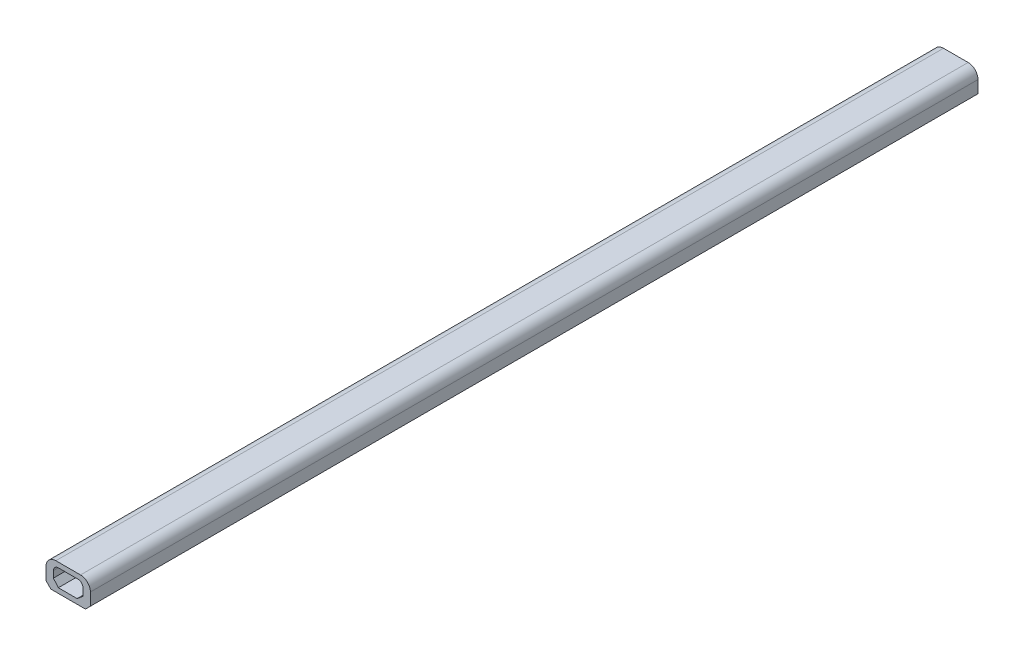
ISO-10303-21;
HEADER;
FILE_DESCRIPTION(('STEP AP214'),'2;1');
FILE_NAME('part.step','',(''),(''),'','','');
FILE_SCHEMA(('AUTOMOTIVE_DESIGN { 1 0 10303 214 1 1 1 1 }'));
ENDSEC;
DATA;
#1=APPLICATION_CONTEXT('core data for automotive mechanical design processes');
#2=APPLICATION_PROTOCOL_DEFINITION('international standard','automotive_design',2000,#1);
#3=PRODUCT_CONTEXT('',#1,'mechanical');
#4=PRODUCT('Part','Part','',(#3));
#5=PRODUCT_RELATED_PRODUCT_CATEGORY('part','',(#4));
#6=PRODUCT_DEFINITION_FORMATION('','',#4);
#7=PRODUCT_DEFINITION_CONTEXT('part definition',#1,'design');
#8=PRODUCT_DEFINITION('design','',#6,#7);
#9=PRODUCT_DEFINITION_SHAPE('','',#8);
#10=(LENGTH_UNIT() NAMED_UNIT(*) SI_UNIT(.MILLI.,.METRE.));
#11=(NAMED_UNIT(*) PLANE_ANGLE_UNIT() SI_UNIT($,.RADIAN.));
#12=(NAMED_UNIT(*) SI_UNIT($,.STERADIAN.) SOLID_ANGLE_UNIT());
#13=UNCERTAINTY_MEASURE_WITH_UNIT(LENGTH_MEASURE(1.E-05),#10,'distance_accuracy_value','');
#14=(GEOMETRIC_REPRESENTATION_CONTEXT(3) GLOBAL_UNCERTAINTY_ASSIGNED_CONTEXT((#13)) GLOBAL_UNIT_ASSIGNED_CONTEXT((#10,
#11,#12)) REPRESENTATION_CONTEXT('',''));
#15=CARTESIAN_POINT('',(0.,0.,0.));
#16=DIRECTION('',(0.,0.,1.));
#17=DIRECTION('',(1.,0.,0.));
#18=AXIS2_PLACEMENT_3D('',#15,#16,#17);
#19=CARTESIAN_POINT('',(0.,0.,180.));
#20=DIRECTION('',(1.,0.,0.));
#21=DIRECTION('',(0.,1.,0.));
#22=AXIS2_PLACEMENT_3D('',#19,#20,#21);
#23=PLANE('',#22);
#24=DIRECTION('',(0.,-1.,0.));
#25=VECTOR('',#24,1.);
#26=CARTESIAN_POINT('',(0.,0.,0.));
#27=LINE('',#26,#25);
#28=CARTESIAN_POINT('',(0.,-2.,0.));
#29=VERTEX_POINT('',#28);
#30=CARTESIAN_POINT('',(0.,-4.5,0.));
#31=VERTEX_POINT('',#30);
#32=EDGE_CURVE('E169',#29,#31,#27,.T.);
#33=ORIENTED_EDGE('',*,*,#32,.T.);
#34=DIRECTION('',(0.,0.,1.));
#35=VECTOR('',#34,1.);
#36=CARTESIAN_POINT('',(0.,-4.5,180.));
#37=LINE('',#36,#35);
#38=CARTESIAN_POINT('',(0.,-4.5,180.));
#39=VERTEX_POINT('',#38);
#40=EDGE_CURVE('E212',#31,#39,#37,.T.);
#41=ORIENTED_EDGE('',*,*,#40,.T.);
#42=DIRECTION('',(0.,-1.,0.));
#43=VECTOR('',#42,1.);
#44=CARTESIAN_POINT('',(0.,0.,180.));
#45=LINE('',#44,#43);
#46=CARTESIAN_POINT('',(0.,-2.,180.));
#47=VERTEX_POINT('',#46);
#48=EDGE_CURVE('E172',#47,#39,#45,.T.);
#49=ORIENTED_EDGE('',*,*,#48,.F.);
#50=DIRECTION('',(0.,0.,-1.));
#51=VECTOR('',#50,1.);
#52=CARTESIAN_POINT('',(0.,-2.,180.));
#53=LINE('',#52,#51);
#54=EDGE_CURVE('E157',#47,#29,#53,.T.);
#55=ORIENTED_EDGE('',*,*,#54,.T.);
#56=EDGE_LOOP('',(#33,#41,#49,#55));
#57=FACE_BOUND('',#56,.T.);
#58=ADVANCED_FACE('F39',(#57),#23,.F.);
#59=CARTESIAN_POINT('',(0.,-5.5,180.));
#60=DIRECTION('',(0.,1.,0.));
#61=DIRECTION('',(0.,0.,1.));
#62=AXIS2_PLACEMENT_3D('',#59,#60,#61);
#63=PLANE('',#62);
#64=DIRECTION('',(1.,0.,0.));
#65=VECTOR('',#64,1.);
#66=CARTESIAN_POINT('',(0.,-5.5,180.));
#67=LINE('',#66,#65);
#68=CARTESIAN_POINT('',(0.999999999999973,-5.5,180.));
#69=VERTEX_POINT('',#68);
#70=CARTESIAN_POINT('',(8.,-5.5,180.));
#71=VERTEX_POINT('',#70);
#72=EDGE_CURVE('E288',#69,#71,#67,.T.);
#73=ORIENTED_EDGE('',*,*,#72,.F.);
#74=DIRECTION('',(0.,0.,-1.));
#75=VECTOR('',#74,1.);
#76=CARTESIAN_POINT('',(0.999999999999973,-5.5,180.));
#77=LINE('',#76,#75);
#78=CARTESIAN_POINT('',(0.999999999999973,-5.5,0.));
#79=VERTEX_POINT('',#78);
#80=EDGE_CURVE('E206',#69,#79,#77,.T.);
#81=ORIENTED_EDGE('',*,*,#80,.T.);
#82=DIRECTION('',(1.,0.,0.));
#83=VECTOR('',#82,1.);
#84=CARTESIAN_POINT('',(0.,-5.5,0.));
#85=LINE('',#84,#83);
#86=CARTESIAN_POINT('',(8.,-5.5,0.));
#87=VERTEX_POINT('',#86);
#88=EDGE_CURVE('E178',#79,#87,#85,.T.);
#89=ORIENTED_EDGE('',*,*,#88,.T.);
#90=DIRECTION('',(0.,0.,1.));
#91=VECTOR('',#90,1.);
#92=CARTESIAN_POINT('',(8.,-5.5,180.));
#93=LINE('',#92,#91);
#94=EDGE_CURVE('E204',#87,#71,#93,.T.);
#95=ORIENTED_EDGE('',*,*,#94,.T.);
#96=EDGE_LOOP('',(#73,#81,#89,#95));
#97=FACE_BOUND('',#96,.T.);
#98=ADVANCED_FACE('F311',(#97),#63,.F.);
#99=CARTESIAN_POINT('',(9.,0.,180.));
#100=DIRECTION('',(-1.,0.,0.));
#101=DIRECTION('',(0.,0.,1.));
#102=AXIS2_PLACEMENT_3D('',#99,#100,#101);
#103=PLANE('',#102);
#104=DIRECTION('',(0.,1.,0.));
#105=VECTOR('',#104,1.);
#106=CARTESIAN_POINT('',(9.,0.,180.));
#107=LINE('',#106,#105);
#108=CARTESIAN_POINT('',(9.,-4.5,180.));
#109=VERTEX_POINT('',#108);
#110=CARTESIAN_POINT('',(9.,-2.,180.));
#111=VERTEX_POINT('',#110);
#112=EDGE_CURVE('E290',#109,#111,#107,.T.);
#113=ORIENTED_EDGE('',*,*,#112,.F.);
#114=DIRECTION('',(0.,0.,-1.));
#115=VECTOR('',#114,1.);
#116=CARTESIAN_POINT('',(9.,-4.5,180.));
#117=LINE('',#116,#115);
#118=CARTESIAN_POINT('',(9.,-4.5,0.));
#119=VERTEX_POINT('',#118);
#120=EDGE_CURVE('E218',#109,#119,#117,.T.);
#121=ORIENTED_EDGE('',*,*,#120,.T.);
#122=DIRECTION('',(0.,1.,0.));
#123=VECTOR('',#122,1.);
#124=CARTESIAN_POINT('',(9.,0.,0.));
#125=LINE('',#124,#123);
#126=CARTESIAN_POINT('',(9.,-2.,0.));
#127=VERTEX_POINT('',#126);
#128=EDGE_CURVE('E182',#119,#127,#125,.T.);
#129=ORIENTED_EDGE('',*,*,#128,.T.);
#130=DIRECTION('',(0.,0.,-1.));
#131=VECTOR('',#130,1.);
#132=CARTESIAN_POINT('',(9.,-2.,180.));
#133=LINE('',#132,#131);
#134=EDGE_CURVE('E201',#127,#111,#133,.F.);
#135=ORIENTED_EDGE('',*,*,#134,.T.);
#136=EDGE_LOOP('',(#113,#121,#129,#135));
#137=FACE_BOUND('',#136,.T.);
#138=ADVANCED_FACE('F303',(#137),#103,.F.);
#139=CARTESIAN_POINT('',(0.,0.,180.));
#140=DIRECTION('',(0.,-1.,0.));
#141=DIRECTION('',(0.,0.,-1.));
#142=AXIS2_PLACEMENT_3D('',#139,#140,#141);
#143=PLANE('',#142);
#144=DIRECTION('',(-1.,0.,0.));
#145=VECTOR('',#144,1.);
#146=CARTESIAN_POINT('',(0.,0.,0.));
#147=LINE('',#146,#145);
#148=CARTESIAN_POINT('',(7.,0.,0.));
#149=VERTEX_POINT('',#148);
#150=CARTESIAN_POINT('',(2.,0.,0.));
#151=VERTEX_POINT('',#150);
#152=EDGE_CURVE('E190',#149,#151,#147,.T.);
#153=ORIENTED_EDGE('',*,*,#152,.T.);
#154=DIRECTION('',(0.,0.,-1.));
#155=VECTOR('',#154,1.);
#156=CARTESIAN_POINT('',(2.,0.,180.));
#157=LINE('',#156,#155);
#158=CARTESIAN_POINT('',(2.,0.,180.));
#159=VERTEX_POINT('',#158);
#160=EDGE_CURVE('E158',#151,#159,#157,.F.);
#161=ORIENTED_EDGE('',*,*,#160,.T.);
#162=DIRECTION('',(-1.,0.,0.));
#163=VECTOR('',#162,1.);
#164=CARTESIAN_POINT('',(0.,0.,180.));
#165=LINE('',#164,#163);
#166=CARTESIAN_POINT('',(7.,0.,180.));
#167=VERTEX_POINT('',#166);
#168=EDGE_CURVE('E173',#167,#159,#165,.T.);
#169=ORIENTED_EDGE('',*,*,#168,.F.);
#170=DIRECTION('',(0.,0.,-1.));
#171=VECTOR('',#170,1.);
#172=CARTESIAN_POINT('',(7.,0.,180.));
#173=LINE('',#172,#171);
#174=EDGE_CURVE('E163',#167,#149,#173,.T.);
#175=ORIENTED_EDGE('',*,*,#174,.T.);
#176=EDGE_LOOP('',(#153,#161,#169,#175));
#177=FACE_BOUND('',#176,.T.);
#178=ADVANCED_FACE('F297',(#177),#143,.F.);
#179=CARTESIAN_POINT('',(0.,0.,180.));
#180=DIRECTION('',(0.,0.,1.));
#181=DIRECTION('',(1.,0.,0.));
#182=AXIS2_PLACEMENT_3D('',#179,#180,#181);
#183=PLANE('',#182);
#184=DIRECTION('',(0.,-1.,0.));
#185=VECTOR('',#184,1.);
#186=CARTESIAN_POINT('',(7.5,-1.,180.));
#187=LINE('',#186,#185);
#188=CARTESIAN_POINT('',(7.5,-2.,180.));
#189=VERTEX_POINT('',#188);
#190=CARTESIAN_POINT('',(7.5,-3.49999999999999,180.));
#191=VERTEX_POINT('',#190);
#192=EDGE_CURVE('E179',#189,#191,#187,.T.);
#193=ORIENTED_EDGE('',*,*,#192,.T.);
#194=DIRECTION('',(0.766044443118982,0.642787609686535,0.));
#195=VECTOR('',#194,1.);
#196=CARTESIAN_POINT('',(6.30824640740576,-4.5,180.));
#197=LINE('',#196,#195);
#198=CARTESIAN_POINT('',(6.30824640740576,-4.5,180.));
#199=VERTEX_POINT('',#198);
#200=EDGE_CURVE('E11',#191,#199,#197,.F.);
#201=ORIENTED_EDGE('',*,*,#200,.T.);
#202=DIRECTION('',(-1.,0.,0.));
#203=VECTOR('',#202,1.);
#204=CARTESIAN_POINT('',(7.5,-4.5,180.));
#205=LINE('',#204,#203);
#206=CARTESIAN_POINT('',(2.50000000000002,-4.5,180.));
#207=VERTEX_POINT('',#206);
#208=EDGE_CURVE('E261',#199,#207,#205,.T.);
#209=ORIENTED_EDGE('',*,*,#208,.T.);
#210=DIRECTION('',(-0.642787609686535,0.766044443118982,0.));
#211=VECTOR('',#210,1.);
#212=CARTESIAN_POINT('',(1.5,-3.30824640740576,180.));
#213=LINE('',#212,#211);
#214=CARTESIAN_POINT('',(1.5,-3.30824640740576,180.));
#215=VERTEX_POINT('',#214);
#216=EDGE_CURVE('E250',#207,#215,#213,.T.);
#217=ORIENTED_EDGE('',*,*,#216,.T.);
#218=DIRECTION('',(0.,-1.,0.));
#219=VECTOR('',#218,1.);
#220=CARTESIAN_POINT('',(1.5,-1.,180.));
#221=LINE('',#220,#219);
#222=CARTESIAN_POINT('',(1.5,-2.,180.));
#223=VERTEX_POINT('',#222);
#224=EDGE_CURVE('E258',#223,#215,#221,.T.);
#225=ORIENTED_EDGE('',*,*,#224,.F.);
#226=CARTESIAN_POINT('',(2.5,-2.,180.));
#227=DIRECTION('',(0.,0.,1.));
#228=DIRECTION('',(1.,0.,0.));
#229=AXIS2_PLACEMENT_3D('',#226,#227,#228);
#230=CIRCLE('',#229,1.);
#231=CARTESIAN_POINT('',(2.5,-1.,180.));
#232=VERTEX_POINT('',#231);
#233=EDGE_CURVE('E233',#223,#232,#230,.F.);
#234=ORIENTED_EDGE('',*,*,#233,.T.);
#235=DIRECTION('',(-1.,0.,0.));
#236=VECTOR('',#235,1.);
#237=CARTESIAN_POINT('',(7.5,-1.,180.));
#238=LINE('',#237,#236);
#239=CARTESIAN_POINT('',(6.5,-1.,180.));
#240=VERTEX_POINT('',#239);
#241=EDGE_CURVE('E184',#240,#232,#238,.T.);
#242=ORIENTED_EDGE('',*,*,#241,.F.);
#243=CARTESIAN_POINT('',(6.5,-2.,180.));
#244=DIRECTION('',(0.,0.,1.));
#245=DIRECTION('',(1.,0.,0.));
#246=AXIS2_PLACEMENT_3D('',#243,#244,#245);
#247=CIRCLE('',#246,1.);
#248=EDGE_CURVE('E237',#240,#189,#247,.F.);
#249=ORIENTED_EDGE('',*,*,#248,.T.);
#250=EDGE_LOOP('',(#193,#201,#209,#217,#225,#234,#242,#249));
#251=FACE_BOUND('',#250,.T.);
#252=ORIENTED_EDGE('',*,*,#48,.T.);
#253=DIRECTION('',(-0.707106781186537,0.707106781186558,0.));
#254=VECTOR('',#253,1.);
#255=CARTESIAN_POINT('',(-2.25,-2.24999999999993,180.));
#256=LINE('',#255,#254);
#257=EDGE_CURVE('E216',#39,#69,#256,.F.);
#258=ORIENTED_EDGE('',*,*,#257,.T.);
#259=ORIENTED_EDGE('',*,*,#72,.T.);
#260=DIRECTION('',(-0.707106781186548,-0.707106781186547,0.));
#261=VECTOR('',#260,1.);
#262=CARTESIAN_POINT('',(6.75,-6.75,180.));
#263=LINE('',#262,#261);
#264=EDGE_CURVE('E214',#71,#109,#263,.F.);
#265=ORIENTED_EDGE('',*,*,#264,.T.);
#266=ORIENTED_EDGE('',*,*,#112,.T.);
#267=CARTESIAN_POINT('',(7.,-2.,180.));
#268=DIRECTION('',(0.,0.,1.));
#269=DIRECTION('',(1.,0.,0.));
#270=AXIS2_PLACEMENT_3D('',#267,#268,#269);
#271=CIRCLE('',#270,2.);
#272=EDGE_CURVE('E197',#111,#167,#271,.T.);
#273=ORIENTED_EDGE('',*,*,#272,.T.);
#274=ORIENTED_EDGE('',*,*,#168,.T.);
#275=CARTESIAN_POINT('',(2.,-2.,180.));
#276=DIRECTION('',(0.,0.,1.));
#277=DIRECTION('',(1.,0.,0.));
#278=AXIS2_PLACEMENT_3D('',#275,#276,#277);
#279=CIRCLE('',#278,2.);
#280=EDGE_CURVE('E199',#159,#47,#279,.T.);
#281=ORIENTED_EDGE('',*,*,#280,.T.);
#282=EDGE_LOOP('',(#252,#258,#259,#265,#266,#273,#274,#281));
#283=FACE_BOUND('',#282,.T.);
#284=ADVANCED_FACE('F256',(#251,#283),#183,.T.);
#285=CARTESIAN_POINT('',(0.,0.,0.));
#286=DIRECTION('',(0.,0.,1.));
#287=DIRECTION('',(1.,0.,0.));
#288=AXIS2_PLACEMENT_3D('',#285,#286,#287);
#289=PLANE('',#288);
#290=DIRECTION('',(-1.,0.,0.));
#291=VECTOR('',#290,1.);
#292=CARTESIAN_POINT('',(7.5,-1.,0.));
#293=LINE('',#292,#291);
#294=CARTESIAN_POINT('',(6.5,-1.,0.));
#295=VERTEX_POINT('',#294);
#296=CARTESIAN_POINT('',(2.5,-1.,0.));
#297=VERTEX_POINT('',#296);
#298=EDGE_CURVE('E280',#295,#297,#293,.T.);
#299=ORIENTED_EDGE('',*,*,#298,.T.);
#300=CARTESIAN_POINT('',(2.5,-2.,0.));
#301=DIRECTION('',(0.,0.,1.));
#302=DIRECTION('',(1.,0.,0.));
#303=AXIS2_PLACEMENT_3D('',#300,#301,#302);
#304=CIRCLE('',#303,1.);
#305=CARTESIAN_POINT('',(1.5,-2.,0.));
#306=VERTEX_POINT('',#305);
#307=EDGE_CURVE('E231',#297,#306,#304,.T.);
#308=ORIENTED_EDGE('',*,*,#307,.T.);
#309=DIRECTION('',(0.,-1.,0.));
#310=VECTOR('',#309,1.);
#311=CARTESIAN_POINT('',(1.5,-1.,0.));
#312=LINE('',#311,#310);
#313=CARTESIAN_POINT('',(1.5,-3.30824640740576,0.));
#314=VERTEX_POINT('',#313);
#315=EDGE_CURVE('E275',#306,#314,#312,.T.);
#316=ORIENTED_EDGE('',*,*,#315,.T.);
#317=DIRECTION('',(0.642787609686535,-0.766044443118982,0.));
#318=VECTOR('',#317,1.);
#319=CARTESIAN_POINT('',(-0.748757222193779,-0.628281908984117,0.));
#320=LINE('',#319,#318);
#321=CARTESIAN_POINT('',(2.50000000000002,-4.5,0.));
#322=VERTEX_POINT('',#321);
#323=EDGE_CURVE('E248',#314,#322,#320,.T.);
#324=ORIENTED_EDGE('',*,*,#323,.T.);
#325=DIRECTION('',(-1.,0.,0.));
#326=VECTOR('',#325,1.);
#327=CARTESIAN_POINT('',(7.5,-4.5,0.));
#328=LINE('',#327,#326);
#329=CARTESIAN_POINT('',(6.30824640740576,-4.5,0.));
#330=VERTEX_POINT('',#329);
#331=EDGE_CURVE('E274',#330,#322,#328,.T.);
#332=ORIENTED_EDGE('',*,*,#331,.F.);
#333=DIRECTION('',(-0.766044443118982,-0.642787609686535,0.));
#334=VECTOR('',#333,1.);
#335=CARTESIAN_POINT('',(4.82223290152032,-5.74691338471291,0.));
#336=LINE('',#335,#334);
#337=CARTESIAN_POINT('',(7.5,-3.49999999999999,0.));
#338=VERTEX_POINT('',#337);
#339=EDGE_CURVE('E48',#330,#338,#336,.F.);
#340=ORIENTED_EDGE('',*,*,#339,.T.);
#341=DIRECTION('',(0.,-1.,0.));
#342=VECTOR('',#341,1.);
#343=CARTESIAN_POINT('',(7.5,-1.,0.));
#344=LINE('',#343,#342);
#345=CARTESIAN_POINT('',(7.5,-2.,0.));
#346=VERTEX_POINT('',#345);
#347=EDGE_CURVE('E285',#346,#338,#344,.T.);
#348=ORIENTED_EDGE('',*,*,#347,.F.);
#349=CARTESIAN_POINT('',(6.5,-2.,0.));
#350=DIRECTION('',(0.,0.,1.));
#351=DIRECTION('',(1.,0.,0.));
#352=AXIS2_PLACEMENT_3D('',#349,#350,#351);
#353=CIRCLE('',#352,1.);
#354=EDGE_CURVE('E235',#346,#295,#353,.T.);
#355=ORIENTED_EDGE('',*,*,#354,.T.);
#356=EDGE_LOOP('',(#299,#308,#316,#324,#332,#340,#348,#355));
#357=FACE_BOUND('',#356,.T.);
#358=ORIENTED_EDGE('',*,*,#88,.F.);
#359=DIRECTION('',(0.707106781186537,-0.707106781186558,0.));
#360=VECTOR('',#359,1.);
#361=CARTESIAN_POINT('',(0.999999999999973,-5.5,0.));
#362=LINE('',#361,#360);
#363=EDGE_CURVE('E177',#79,#31,#362,.F.);
#364=ORIENTED_EDGE('',*,*,#363,.T.);
#365=ORIENTED_EDGE('',*,*,#32,.F.);
#366=CARTESIAN_POINT('',(2.,-2.,0.));
#367=DIRECTION('',(0.,0.,1.));
#368=DIRECTION('',(1.,0.,0.));
#369=AXIS2_PLACEMENT_3D('',#366,#367,#368);
#370=CIRCLE('',#369,2.);
#371=EDGE_CURVE('E153',#29,#151,#370,.F.);
#372=ORIENTED_EDGE('',*,*,#371,.T.);
#373=ORIENTED_EDGE('',*,*,#152,.F.);
#374=CARTESIAN_POINT('',(7.,-2.,0.));
#375=DIRECTION('',(0.,0.,1.));
#376=DIRECTION('',(1.,0.,0.));
#377=AXIS2_PLACEMENT_3D('',#374,#375,#376);
#378=CIRCLE('',#377,2.);
#379=EDGE_CURVE('E164',#149,#127,#378,.F.);
#380=ORIENTED_EDGE('',*,*,#379,.T.);
#381=ORIENTED_EDGE('',*,*,#128,.F.);
#382=DIRECTION('',(0.707106781186548,0.707106781186547,0.));
#383=VECTOR('',#382,1.);
#384=CARTESIAN_POINT('',(9.,-4.5,0.));
#385=LINE('',#384,#383);
#386=EDGE_CURVE('E209',#119,#87,#385,.F.);
#387=ORIENTED_EDGE('',*,*,#386,.T.);
#388=EDGE_LOOP('',(#358,#364,#365,#372,#373,#380,#381,#387));
#389=FACE_BOUND('',#388,.T.);
#390=ADVANCED_FACE('F176',(#357,#389),#289,.F.);
#391=CARTESIAN_POINT('',(2.,-2.,180.));
#392=DIRECTION('',(0.,0.,-1.));
#393=DIRECTION('',(-1.,0.,0.));
#394=AXIS2_PLACEMENT_3D('',#391,#392,#393);
#395=CYLINDRICAL_SURFACE('',#394,2.);
#396=ORIENTED_EDGE('',*,*,#280,.F.);
#397=ORIENTED_EDGE('',*,*,#160,.F.);
#398=ORIENTED_EDGE('',*,*,#371,.F.);
#399=ORIENTED_EDGE('',*,*,#54,.F.);
#400=EDGE_LOOP('',(#396,#397,#398,#399));
#401=FACE_BOUND('',#400,.T.);
#402=ADVANCED_FACE('F156',(#401),#395,.T.);
#403=CARTESIAN_POINT('',(7.,-2.,180.));
#404=DIRECTION('',(0.,0.,-1.));
#405=DIRECTION('',(-1.,0.,0.));
#406=AXIS2_PLACEMENT_3D('',#403,#404,#405);
#407=CYLINDRICAL_SURFACE('',#406,2.);
#408=ORIENTED_EDGE('',*,*,#272,.F.);
#409=ORIENTED_EDGE('',*,*,#134,.F.);
#410=ORIENTED_EDGE('',*,*,#379,.F.);
#411=ORIENTED_EDGE('',*,*,#174,.F.);
#412=EDGE_LOOP('',(#408,#409,#410,#411));
#413=FACE_BOUND('',#412,.T.);
#414=ADVANCED_FACE('F299',(#413),#407,.T.);
#415=CARTESIAN_POINT('',(0.999999999999973,-5.5,180.));
#416=DIRECTION('',(0.707106781186558,0.707106781186537,0.));
#417=DIRECTION('',(0.,0.,-1.));
#418=AXIS2_PLACEMENT_3D('',#415,#416,#417);
#419=PLANE('',#418);
#420=ORIENTED_EDGE('',*,*,#257,.F.);
#421=ORIENTED_EDGE('',*,*,#40,.F.);
#422=ORIENTED_EDGE('',*,*,#363,.F.);
#423=ORIENTED_EDGE('',*,*,#80,.F.);
#424=EDGE_LOOP('',(#420,#421,#422,#423));
#425=FACE_BOUND('',#424,.T.);
#426=ADVANCED_FACE('F315',(#425),#419,.F.);
#427=CARTESIAN_POINT('',(9.,-4.5,180.));
#428=DIRECTION('',(-0.707106781186547,0.707106781186548,0.));
#429=DIRECTION('',(0.,0.,-1.));
#430=AXIS2_PLACEMENT_3D('',#427,#428,#429);
#431=PLANE('',#430);
#432=ORIENTED_EDGE('',*,*,#264,.F.);
#433=ORIENTED_EDGE('',*,*,#94,.F.);
#434=ORIENTED_EDGE('',*,*,#386,.F.);
#435=ORIENTED_EDGE('',*,*,#120,.F.);
#436=EDGE_LOOP('',(#432,#433,#434,#435));
#437=FACE_BOUND('',#436,.T.);
#438=ADVANCED_FACE('F307',(#437),#431,.F.);
#439=CARTESIAN_POINT('',(7.5,-4.5,180.));
#440=DIRECTION('',(0.,-1.,0.));
#441=DIRECTION('',(0.,0.,-1.));
#442=AXIS2_PLACEMENT_3D('',#439,#440,#441);
#443=PLANE('',#442);
#444=ORIENTED_EDGE('',*,*,#331,.T.);
#445=DIRECTION('',(0.,0.,1.));
#446=VECTOR('',#445,1.);
#447=CARTESIAN_POINT('',(2.50000000000002,-4.5,180.));
#448=LINE('',#447,#446);
#449=EDGE_CURVE('E245',#322,#207,#448,.T.);
#450=ORIENTED_EDGE('',*,*,#449,.T.);
#451=ORIENTED_EDGE('',*,*,#208,.F.);
#452=DIRECTION('',(0.,0.,-1.));
#453=VECTOR('',#452,1.);
#454=CARTESIAN_POINT('',(6.30824640740576,-4.5,0.));
#455=LINE('',#454,#453);
#456=EDGE_CURVE('E242',#199,#330,#455,.T.);
#457=ORIENTED_EDGE('',*,*,#456,.T.);
#458=EDGE_LOOP('',(#444,#450,#451,#457));
#459=FACE_BOUND('',#458,.T.);
#460=ADVANCED_FACE('F277',(#459),#443,.F.);
#461=CARTESIAN_POINT('',(7.5,-1.,180.));
#462=DIRECTION('',(1.,0.,0.));
#463=DIRECTION('',(0.,1.,0.));
#464=AXIS2_PLACEMENT_3D('',#461,#462,#463);
#465=PLANE('',#464);
#466=ORIENTED_EDGE('',*,*,#347,.T.);
#467=DIRECTION('',(0.,0.,1.));
#468=VECTOR('',#467,1.);
#469=CARTESIAN_POINT('',(7.5,-3.49999999999999,180.));
#470=LINE('',#469,#468);
#471=EDGE_CURVE('E61',#338,#191,#470,.T.);
#472=ORIENTED_EDGE('',*,*,#471,.T.);
#473=ORIENTED_EDGE('',*,*,#192,.F.);
#474=DIRECTION('',(0.,0.,-1.));
#475=VECTOR('',#474,1.);
#476=CARTESIAN_POINT('',(7.5,-2.,180.));
#477=LINE('',#476,#475);
#478=EDGE_CURVE('E228',#189,#346,#477,.T.);
#479=ORIENTED_EDGE('',*,*,#478,.T.);
#480=EDGE_LOOP('',(#466,#472,#473,#479));
#481=FACE_BOUND('',#480,.T.);
#482=ADVANCED_FACE('F380',(#481),#465,.F.);
#483=CARTESIAN_POINT('',(7.5,-1.,180.));
#484=DIRECTION('',(0.,-1.,0.));
#485=DIRECTION('',(0.,0.,-1.));
#486=AXIS2_PLACEMENT_3D('',#483,#484,#485);
#487=PLANE('',#486);
#488=ORIENTED_EDGE('',*,*,#241,.T.);
#489=DIRECTION('',(0.,0.,-1.));
#490=VECTOR('',#489,1.);
#491=CARTESIAN_POINT('',(2.5,-1.,0.));
#492=LINE('',#491,#490);
#493=EDGE_CURVE('E223',#232,#297,#492,.T.);
#494=ORIENTED_EDGE('',*,*,#493,.T.);
#495=ORIENTED_EDGE('',*,*,#298,.F.);
#496=DIRECTION('',(0.,0.,-1.));
#497=VECTOR('',#496,1.);
#498=CARTESIAN_POINT('',(6.5,-1.,180.));
#499=LINE('',#498,#497);
#500=EDGE_CURVE('E221',#295,#240,#499,.F.);
#501=ORIENTED_EDGE('',*,*,#500,.T.);
#502=EDGE_LOOP('',(#488,#494,#495,#501));
#503=FACE_BOUND('',#502,.T.);
#504=ADVANCED_FACE('F390',(#503),#487,.T.);
#505=CARTESIAN_POINT('',(1.5,-1.,180.));
#506=DIRECTION('',(1.,0.,0.));
#507=DIRECTION('',(0.,1.,0.));
#508=AXIS2_PLACEMENT_3D('',#505,#506,#507);
#509=PLANE('',#508);
#510=ORIENTED_EDGE('',*,*,#224,.T.);
#511=DIRECTION('',(0.,0.,-1.));
#512=VECTOR('',#511,1.);
#513=CARTESIAN_POINT('',(1.5,-3.30824640740576,180.));
#514=LINE('',#513,#512);
#515=EDGE_CURVE('E239',#215,#314,#514,.T.);
#516=ORIENTED_EDGE('',*,*,#515,.T.);
#517=ORIENTED_EDGE('',*,*,#315,.F.);
#518=DIRECTION('',(0.,0.,-1.));
#519=VECTOR('',#518,1.);
#520=CARTESIAN_POINT('',(1.5,-2.,180.));
#521=LINE('',#520,#519);
#522=EDGE_CURVE('E226',#306,#223,#521,.F.);
#523=ORIENTED_EDGE('',*,*,#522,.T.);
#524=EDGE_LOOP('',(#510,#516,#517,#523));
#525=FACE_BOUND('',#524,.T.);
#526=ADVANCED_FACE('F266',(#525),#509,.T.);
#527=CARTESIAN_POINT('',(2.5,-2.,180.));
#528=DIRECTION('',(0.,0.,1.));
#529=DIRECTION('',(1.,0.,0.));
#530=AXIS2_PLACEMENT_3D('',#527,#528,#529);
#531=CYLINDRICAL_SURFACE('',#530,1.);
#532=ORIENTED_EDGE('',*,*,#233,.F.);
#533=ORIENTED_EDGE('',*,*,#522,.F.);
#534=ORIENTED_EDGE('',*,*,#307,.F.);
#535=ORIENTED_EDGE('',*,*,#493,.F.);
#536=EDGE_LOOP('',(#532,#533,#534,#535));
#537=FACE_BOUND('',#536,.T.);
#538=ADVANCED_FACE('F402',(#537),#531,.F.);
#539=CARTESIAN_POINT('',(6.5,-2.,180.));
#540=DIRECTION('',(0.,0.,-1.));
#541=DIRECTION('',(-1.,0.,0.));
#542=AXIS2_PLACEMENT_3D('',#539,#540,#541);
#543=CYLINDRICAL_SURFACE('',#542,1.);
#544=ORIENTED_EDGE('',*,*,#248,.F.);
#545=ORIENTED_EDGE('',*,*,#500,.F.);
#546=ORIENTED_EDGE('',*,*,#354,.F.);
#547=ORIENTED_EDGE('',*,*,#478,.F.);
#548=EDGE_LOOP('',(#544,#545,#546,#547));
#549=FACE_BOUND('',#548,.T.);
#550=ADVANCED_FACE('F365',(#549),#543,.F.);
#551=CARTESIAN_POINT('',(1.5,-3.30824640740576,180.));
#552=DIRECTION('',(-0.766044443118982,-0.642787609686535,0.));
#553=DIRECTION('',(0.,0.,-1.));
#554=AXIS2_PLACEMENT_3D('',#551,#552,#553);
#555=PLANE('',#554);
#556=ORIENTED_EDGE('',*,*,#216,.F.);
#557=ORIENTED_EDGE('',*,*,#449,.F.);
#558=ORIENTED_EDGE('',*,*,#323,.F.);
#559=ORIENTED_EDGE('',*,*,#515,.F.);
#560=EDGE_LOOP('',(#556,#557,#558,#559));
#561=FACE_BOUND('',#560,.T.);
#562=ADVANCED_FACE('F271',(#561),#555,.F.);
#563=CARTESIAN_POINT('',(6.30824640740576,-4.5,180.));
#564=DIRECTION('',(-0.642787609686535,0.766044443118982,0.));
#565=DIRECTION('',(0.,0.,1.));
#566=AXIS2_PLACEMENT_3D('',#563,#564,#565);
#567=PLANE('',#566);
#568=ORIENTED_EDGE('',*,*,#200,.F.);
#569=ORIENTED_EDGE('',*,*,#471,.F.);
#570=ORIENTED_EDGE('',*,*,#339,.F.);
#571=ORIENTED_EDGE('',*,*,#456,.F.);
#572=EDGE_LOOP('',(#568,#569,#570,#571));
#573=FACE_BOUND('',#572,.T.);
#574=ADVANCED_FACE('F42',(#573),#567,.T.);
#575=CLOSED_SHELL('',(#58,#98,#138,#178,#284,#390,#402,#414,#426,#438,#460,#482,#504,#526,#538,
#550,#562,#574));
#576=MANIFOLD_SOLID_BREP('B2',#575);
#577=ADVANCED_BREP_SHAPE_REPRESENTATION('',(#18,#576),#14);
#578=SHAPE_DEFINITION_REPRESENTATION(#9,#577);
ENDSEC;
END-ISO-10303-21;
